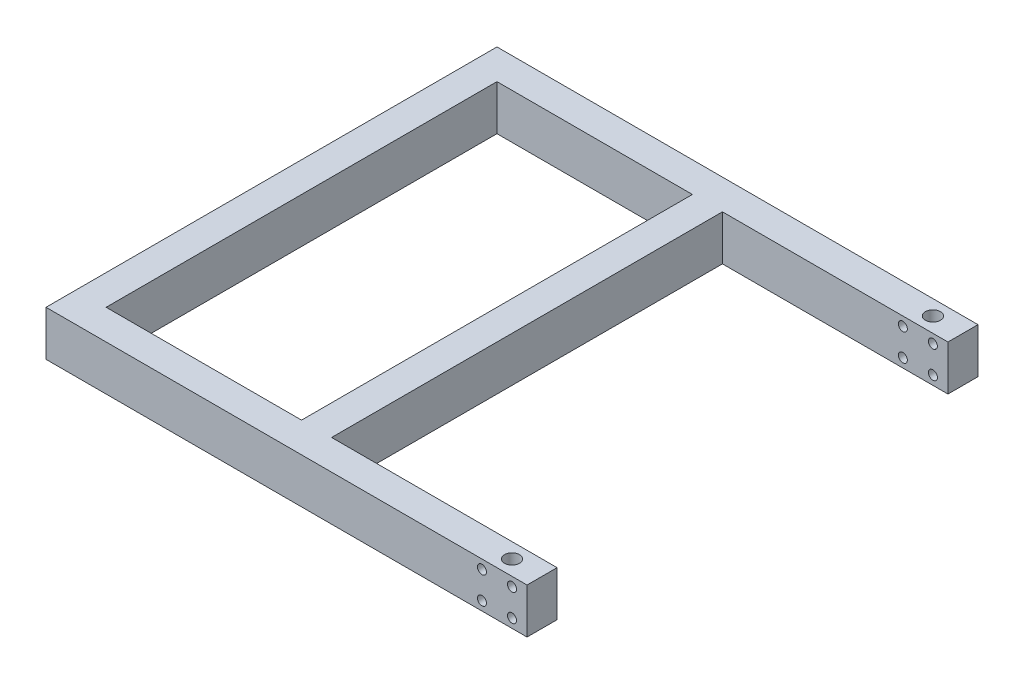
ISO-10303-21;
HEADER;
FILE_DESCRIPTION(('STEP AP214'),'2;1');
FILE_NAME('part.step','',(''),(''),'','','');
FILE_SCHEMA(('AUTOMOTIVE_DESIGN { 1 0 10303 214 1 1 1 1 }'));
ENDSEC;
DATA;
#1=APPLICATION_CONTEXT('core data for automotive mechanical design processes');
#2=APPLICATION_PROTOCOL_DEFINITION('international standard','automotive_design',2000,#1);
#3=PRODUCT_CONTEXT('',#1,'mechanical');
#4=PRODUCT('Part','Part','',(#3));
#5=PRODUCT_RELATED_PRODUCT_CATEGORY('part','',(#4));
#6=PRODUCT_DEFINITION_FORMATION('','',#4);
#7=PRODUCT_DEFINITION_CONTEXT('part definition',#1,'design');
#8=PRODUCT_DEFINITION('design','',#6,#7);
#9=PRODUCT_DEFINITION_SHAPE('','',#8);
#10=(LENGTH_UNIT() NAMED_UNIT(*) SI_UNIT(.MILLI.,.METRE.));
#11=(NAMED_UNIT(*) PLANE_ANGLE_UNIT() SI_UNIT($,.RADIAN.));
#12=(NAMED_UNIT(*) SI_UNIT($,.STERADIAN.) SOLID_ANGLE_UNIT());
#13=UNCERTAINTY_MEASURE_WITH_UNIT(LENGTH_MEASURE(1.E-05),#10,'distance_accuracy_value','');
#14=(GEOMETRIC_REPRESENTATION_CONTEXT(3) GLOBAL_UNCERTAINTY_ASSIGNED_CONTEXT((#13)) GLOBAL_UNIT_ASSIGNED_CONTEXT((#10,
#11,#12)) REPRESENTATION_CONTEXT('',''));
#15=CARTESIAN_POINT('',(0.,0.,0.));
#16=DIRECTION('',(0.,0.,1.));
#17=DIRECTION('',(1.,0.,0.));
#18=AXIS2_PLACEMENT_3D('',#15,#16,#17);
#19=CARTESIAN_POINT('',(-85.,15.,0.));
#20=DIRECTION('',(1.,0.,0.));
#21=DIRECTION('',(0.,0.,-1.));
#22=AXIS2_PLACEMENT_3D('',#19,#20,#21);
#23=PLANE('',#22);
#24=DIRECTION('',(0.,0.,1.));
#25=VECTOR('',#24,1.);
#26=CARTESIAN_POINT('',(-85.,0.,0.));
#27=LINE('',#26,#25);
#28=CARTESIAN_POINT('',(-85.,0.,-63.0645161290323));
#29=VERTEX_POINT('',#28);
#30=CARTESIAN_POINT('',(-85.,0.,66.9354838709677));
#31=VERTEX_POINT('',#30);
#32=EDGE_CURVE('E194',#29,#31,#27,.T.);
#33=ORIENTED_EDGE('',*,*,#32,.T.);
#34=DIRECTION('',(0.,-1.,0.));
#35=VECTOR('',#34,1.);
#36=CARTESIAN_POINT('',(-85.,15.,66.9354838709677));
#37=LINE('',#36,#35);
#38=CARTESIAN_POINT('',(-85.,15.,66.9354838709677));
#39=VERTEX_POINT('',#38);
#40=EDGE_CURVE('E11',#39,#31,#37,.T.);
#41=ORIENTED_EDGE('',*,*,#40,.F.);
#42=DIRECTION('',(0.,0.,1.));
#43=VECTOR('',#42,1.);
#44=CARTESIAN_POINT('',(-85.,15.,0.));
#45=LINE('',#44,#43);
#46=CARTESIAN_POINT('',(-85.,15.,-63.0645161290323));
#47=VERTEX_POINT('',#46);
#48=EDGE_CURVE('E145',#47,#39,#45,.T.);
#49=ORIENTED_EDGE('',*,*,#48,.F.);
#50=DIRECTION('',(0.,-1.,0.));
#51=VECTOR('',#50,1.);
#52=CARTESIAN_POINT('',(-85.,15.,-63.0645161290323));
#53=LINE('',#52,#51);
#54=EDGE_CURVE('E60',#47,#29,#53,.T.);
#55=ORIENTED_EDGE('',*,*,#54,.T.);
#56=EDGE_LOOP('',(#33,#41,#49,#55));
#57=FACE_BOUND('',#56,.T.);
#58=ADVANCED_FACE('F40',(#57),#23,.F.);
#59=CARTESIAN_POINT('',(0.,15.,66.9354838709677));
#60=DIRECTION('',(0.,0.,1.));
#61=DIRECTION('',(1.,0.,0.));
#62=AXIS2_PLACEMENT_3D('',#59,#60,#61);
#63=PLANE('',#62);
#64=DIRECTION('',(-1.,0.,0.));
#65=VECTOR('',#64,1.);
#66=CARTESIAN_POINT('',(0.,0.,66.9354838709677));
#67=LINE('',#66,#65);
#68=CARTESIAN_POINT('',(-150.,0.,66.9354838709678));
#69=VERTEX_POINT('',#68);
#70=EDGE_CURVE('E152',#31,#69,#67,.T.);
#71=ORIENTED_EDGE('',*,*,#70,.T.);
#72=DIRECTION('',(0.,-1.,0.));
#73=VECTOR('',#72,1.);
#74=CARTESIAN_POINT('',(-150.,15.,66.9354838709678));
#75=LINE('',#74,#73);
#76=CARTESIAN_POINT('',(-150.,15.,66.9354838709678));
#77=VERTEX_POINT('',#76);
#78=EDGE_CURVE('E51',#77,#69,#75,.T.);
#79=ORIENTED_EDGE('',*,*,#78,.F.);
#80=DIRECTION('',(-1.,0.,0.));
#81=VECTOR('',#80,1.);
#82=CARTESIAN_POINT('',(0.,15.,66.9354838709677));
#83=LINE('',#82,#81);
#84=EDGE_CURVE('E139',#39,#77,#83,.T.);
#85=ORIENTED_EDGE('',*,*,#84,.F.);
#86=ORIENTED_EDGE('',*,*,#40,.T.);
#87=EDGE_LOOP('',(#71,#79,#85,#86));
#88=FACE_BOUND('',#87,.T.);
#89=ADVANCED_FACE('F151',(#88),#63,.F.);
#90=CARTESIAN_POINT('',(-150.,15.,0.));
#91=DIRECTION('',(1.,0.,0.));
#92=DIRECTION('',(0.,0.,-1.));
#93=AXIS2_PLACEMENT_3D('',#90,#91,#92);
#94=PLANE('',#93);
#95=DIRECTION('',(0.,0.,1.));
#96=VECTOR('',#95,1.);
#97=CARTESIAN_POINT('',(-150.,0.,0.));
#98=LINE('',#97,#96);
#99=CARTESIAN_POINT('',(-150.,0.,-63.0645161290323));
#100=VERTEX_POINT('',#99);
#101=EDGE_CURVE('E199',#100,#69,#98,.T.);
#102=ORIENTED_EDGE('',*,*,#101,.F.);
#103=DIRECTION('',(0.,-1.,0.));
#104=VECTOR('',#103,1.);
#105=CARTESIAN_POINT('',(-150.,15.,-63.0645161290323));
#106=LINE('',#105,#104);
#107=CARTESIAN_POINT('',(-150.,15.,-63.0645161290323));
#108=VERTEX_POINT('',#107);
#109=EDGE_CURVE('E98',#108,#100,#106,.T.);
#110=ORIENTED_EDGE('',*,*,#109,.F.);
#111=DIRECTION('',(0.,0.,1.));
#112=VECTOR('',#111,1.);
#113=CARTESIAN_POINT('',(-150.,15.,0.));
#114=LINE('',#113,#112);
#115=EDGE_CURVE('E144',#108,#77,#114,.T.);
#116=ORIENTED_EDGE('',*,*,#115,.T.);
#117=ORIENTED_EDGE('',*,*,#78,.T.);
#118=EDGE_LOOP('',(#102,#110,#116,#117));
#119=FACE_BOUND('',#118,.T.);
#120=ADVANCED_FACE('F157',(#119),#94,.T.);
#121=CARTESIAN_POINT('',(-160.,15.,0.));
#122=DIRECTION('',(1.,0.,0.));
#123=DIRECTION('',(0.,0.,-1.));
#124=AXIS2_PLACEMENT_3D('',#121,#122,#123);
#125=PLANE('',#124);
#126=CARTESIAN_POINT('',(-160.,7.5,-63.0645161290323));
#127=DIRECTION('',(-1.,0.,0.));
#128=DIRECTION('',(0.,0.,1.));
#129=AXIS2_PLACEMENT_3D('',#126,#127,#128);
#130=CIRCLE('',#129,2.5);
#131=CARTESIAN_POINT('',(-160.,7.5,-60.5645161290323));
#132=VERTEX_POINT('',#131);
#133=EDGE_CURVE('E379',#132,#132,#130,.T.);
#134=ORIENTED_EDGE('',*,*,#133,.F.);
#135=EDGE_LOOP('',(#134));
#136=FACE_BOUND('',#135,.T.);
#137=CARTESIAN_POINT('',(-160.,7.5,-13.0645161290323));
#138=DIRECTION('',(-1.,0.,0.));
#139=DIRECTION('',(0.,0.,1.));
#140=AXIS2_PLACEMENT_3D('',#137,#138,#139);
#141=CIRCLE('',#140,2.5);
#142=CARTESIAN_POINT('',(-160.,7.5,-10.5645161290323));
#143=VERTEX_POINT('',#142);
#144=EDGE_CURVE('E371',#143,#143,#141,.T.);
#145=ORIENTED_EDGE('',*,*,#144,.F.);
#146=EDGE_LOOP('',(#145));
#147=FACE_BOUND('',#146,.T.);
#148=CARTESIAN_POINT('',(-160.,7.5,16.9354838709677));
#149=DIRECTION('',(-1.,0.,0.));
#150=DIRECTION('',(0.,0.,1.));
#151=AXIS2_PLACEMENT_3D('',#148,#149,#150);
#152=CIRCLE('',#151,2.5);
#153=CARTESIAN_POINT('',(-160.,7.5,19.4354838709677));
#154=VERTEX_POINT('',#153);
#155=EDGE_CURVE('E363',#154,#154,#152,.T.);
#156=ORIENTED_EDGE('',*,*,#155,.F.);
#157=EDGE_LOOP('',(#156));
#158=FACE_BOUND('',#157,.T.);
#159=CARTESIAN_POINT('',(-160.,7.5,66.9354838709677));
#160=DIRECTION('',(-1.,0.,0.));
#161=DIRECTION('',(0.,0.,1.));
#162=AXIS2_PLACEMENT_3D('',#159,#160,#161);
#163=CIRCLE('',#162,2.5);
#164=CARTESIAN_POINT('',(-160.,7.5,69.4354838709677));
#165=VERTEX_POINT('',#164);
#166=EDGE_CURVE('E354',#165,#165,#163,.T.);
#167=ORIENTED_EDGE('',*,*,#166,.F.);
#168=EDGE_LOOP('',(#167));
#169=FACE_BOUND('',#168,.T.);
#170=DIRECTION('',(0.,0.,1.));
#171=VECTOR('',#170,1.);
#172=CARTESIAN_POINT('',(-160.,0.,0.));
#173=LINE('',#172,#171);
#174=CARTESIAN_POINT('',(-160.,0.,-73.0645161290323));
#175=VERTEX_POINT('',#174);
#176=CARTESIAN_POINT('',(-160.,0.,76.9354838709677));
#177=VERTEX_POINT('',#176);
#178=EDGE_CURVE('E166',#175,#177,#173,.T.);
#179=ORIENTED_EDGE('',*,*,#178,.T.);
#180=DIRECTION('',(0.,-1.,0.));
#181=VECTOR('',#180,1.);
#182=CARTESIAN_POINT('',(-160.,15.,76.9354838709677));
#183=LINE('',#182,#181);
#184=CARTESIAN_POINT('',(-160.,15.,76.9354838709677));
#185=VERTEX_POINT('',#184);
#186=EDGE_CURVE('E44',#185,#177,#183,.T.);
#187=ORIENTED_EDGE('',*,*,#186,.F.);
#188=DIRECTION('',(0.,0.,1.));
#189=VECTOR('',#188,1.);
#190=CARTESIAN_POINT('',(-160.,15.,0.));
#191=LINE('',#190,#189);
#192=CARTESIAN_POINT('',(-160.,15.,-73.0645161290323));
#193=VERTEX_POINT('',#192);
#194=EDGE_CURVE('E206',#193,#185,#191,.T.);
#195=ORIENTED_EDGE('',*,*,#194,.F.);
#196=DIRECTION('',(0.,-1.,0.));
#197=VECTOR('',#196,1.);
#198=CARTESIAN_POINT('',(-160.,15.,-73.0645161290323));
#199=LINE('',#198,#197);
#200=EDGE_CURVE('E162',#193,#175,#199,.T.);
#201=ORIENTED_EDGE('',*,*,#200,.T.);
#202=EDGE_LOOP('',(#179,#187,#195,#201));
#203=FACE_BOUND('',#202,.T.);
#204=ADVANCED_FACE('F42',(#136,#147,#158,#169,#203),#125,.F.);
#205=CARTESIAN_POINT('',(0.,15.,76.9354838709677));
#206=DIRECTION('',(0.,0.,-1.));
#207=DIRECTION('',(-1.,0.,0.));
#208=AXIS2_PLACEMENT_3D('',#205,#206,#207);
#209=PLANE('',#208);
#210=CARTESIAN_POINT('',(-5.,3.,76.9354838709677));
#211=DIRECTION('',(0.,0.,1.));
#212=DIRECTION('',(1.,0.,0.));
#213=AXIS2_PLACEMENT_3D('',#210,#211,#212);
#214=CIRCLE('',#213,1.5);
#215=CARTESIAN_POINT('',(-3.5,3.,76.9354838709677));
#216=VERTEX_POINT('',#215);
#217=EDGE_CURVE('E339',#216,#216,#214,.T.);
#218=ORIENTED_EDGE('',*,*,#217,.F.);
#219=EDGE_LOOP('',(#218));
#220=FACE_BOUND('',#219,.T.);
#221=CARTESIAN_POINT('',(-15.,12.,76.9354838709677));
#222=DIRECTION('',(0.,0.,1.));
#223=DIRECTION('',(1.,0.,0.));
#224=AXIS2_PLACEMENT_3D('',#221,#222,#223);
#225=CIRCLE('',#224,1.5);
#226=CARTESIAN_POINT('',(-13.5,12.,76.9354838709677));
#227=VERTEX_POINT('',#226);
#228=EDGE_CURVE('E330',#227,#227,#225,.T.);
#229=ORIENTED_EDGE('',*,*,#228,.F.);
#230=EDGE_LOOP('',(#229));
#231=FACE_BOUND('',#230,.T.);
#232=CARTESIAN_POINT('',(-15.,3.,76.9354838709677));
#233=DIRECTION('',(0.,0.,1.));
#234=DIRECTION('',(1.,0.,0.));
#235=AXIS2_PLACEMENT_3D('',#232,#233,#234);
#236=CIRCLE('',#235,1.5);
#237=CARTESIAN_POINT('',(-13.5,3.,76.9354838709677));
#238=VERTEX_POINT('',#237);
#239=EDGE_CURVE('E346',#238,#238,#236,.T.);
#240=ORIENTED_EDGE('',*,*,#239,.F.);
#241=EDGE_LOOP('',(#240));
#242=FACE_BOUND('',#241,.T.);
#243=CARTESIAN_POINT('',(-5.,12.,76.9354838709677));
#244=DIRECTION('',(0.,0.,1.));
#245=DIRECTION('',(1.,0.,0.));
#246=AXIS2_PLACEMENT_3D('',#243,#244,#245);
#247=CIRCLE('',#246,1.5);
#248=CARTESIAN_POINT('',(-3.5,12.,76.9354838709677));
#249=VERTEX_POINT('',#248);
#250=EDGE_CURVE('E322',#249,#249,#247,.T.);
#251=ORIENTED_EDGE('',*,*,#250,.F.);
#252=EDGE_LOOP('',(#251));
#253=FACE_BOUND('',#252,.T.);
#254=DIRECTION('',(1.,0.,0.));
#255=VECTOR('',#254,1.);
#256=CARTESIAN_POINT('',(0.,0.,76.9354838709677));
#257=LINE('',#256,#255);
#258=CARTESIAN_POINT('',(0.,0.,76.9354838709677));
#259=VERTEX_POINT('',#258);
#260=EDGE_CURVE('E170',#177,#259,#257,.T.);
#261=ORIENTED_EDGE('',*,*,#260,.T.);
#262=DIRECTION('',(0.,-1.,0.));
#263=VECTOR('',#262,1.);
#264=CARTESIAN_POINT('',(0.,15.,76.9354838709677));
#265=LINE('',#264,#263);
#266=CARTESIAN_POINT('',(0.,15.,76.9354838709677));
#267=VERTEX_POINT('',#266);
#268=EDGE_CURVE('E231',#267,#259,#265,.T.);
#269=ORIENTED_EDGE('',*,*,#268,.F.);
#270=DIRECTION('',(1.,0.,0.));
#271=VECTOR('',#270,1.);
#272=CARTESIAN_POINT('',(0.,15.,76.9354838709677));
#273=LINE('',#272,#271);
#274=EDGE_CURVE('E111',#185,#267,#273,.T.);
#275=ORIENTED_EDGE('',*,*,#274,.F.);
#276=ORIENTED_EDGE('',*,*,#186,.T.);
#277=EDGE_LOOP('',(#261,#269,#275,#276));
#278=FACE_BOUND('',#277,.T.);
#279=ADVANCED_FACE('F239',(#220,#231,#242,#253,#278),#209,.F.);
#280=CARTESIAN_POINT('',(0.,15.,0.));
#281=DIRECTION('',(-1.,0.,0.));
#282=DIRECTION('',(0.,0.,1.));
#283=AXIS2_PLACEMENT_3D('',#280,#281,#282);
#284=PLANE('',#283);
#285=DIRECTION('',(0.,0.,-1.));
#286=VECTOR('',#285,1.);
#287=CARTESIAN_POINT('',(0.,0.,0.));
#288=LINE('',#287,#286);
#289=CARTESIAN_POINT('',(0.,0.,66.9354838709677));
#290=VERTEX_POINT('',#289);
#291=EDGE_CURVE('E174',#259,#290,#288,.T.);
#292=ORIENTED_EDGE('',*,*,#291,.T.);
#293=DIRECTION('',(0.,-1.,0.));
#294=VECTOR('',#293,1.);
#295=CARTESIAN_POINT('',(0.,15.,66.9354838709677));
#296=LINE('',#295,#294);
#297=CARTESIAN_POINT('',(0.,15.,66.9354838709677));
#298=VERTEX_POINT('',#297);
#299=EDGE_CURVE('E228',#298,#290,#296,.T.);
#300=ORIENTED_EDGE('',*,*,#299,.F.);
#301=DIRECTION('',(0.,0.,-1.));
#302=VECTOR('',#301,1.);
#303=CARTESIAN_POINT('',(0.,15.,0.));
#304=LINE('',#303,#302);
#305=EDGE_CURVE('E262',#267,#298,#304,.T.);
#306=ORIENTED_EDGE('',*,*,#305,.F.);
#307=ORIENTED_EDGE('',*,*,#268,.T.);
#308=EDGE_LOOP('',(#292,#300,#306,#307));
#309=FACE_BOUND('',#308,.T.);
#310=ADVANCED_FACE('F252',(#309),#284,.F.);
#311=CARTESIAN_POINT('',(0.,15.,66.9354838709677));
#312=DIRECTION('',(0.,0.,1.));
#313=DIRECTION('',(1.,0.,0.));
#314=AXIS2_PLACEMENT_3D('',#311,#312,#313);
#315=PLANE('',#314);
#316=CARTESIAN_POINT('',(-5.,3.,66.9354838709677));
#317=DIRECTION('',(0.,0.,1.));
#318=DIRECTION('',(1.,0.,0.));
#319=AXIS2_PLACEMENT_3D('',#316,#317,#318);
#320=CIRCLE('',#319,1.5);
#321=CARTESIAN_POINT('',(-3.5,3.,66.9354838709677));
#322=VERTEX_POINT('',#321);
#323=EDGE_CURVE('E171',#322,#322,#320,.T.);
#324=ORIENTED_EDGE('',*,*,#323,.T.);
#325=EDGE_LOOP('',(#324));
#326=FACE_BOUND('',#325,.T.);
#327=CARTESIAN_POINT('',(-15.,12.,66.9354838709677));
#328=DIRECTION('',(0.,0.,1.));
#329=DIRECTION('',(1.,0.,0.));
#330=AXIS2_PLACEMENT_3D('',#327,#328,#329);
#331=CIRCLE('',#330,1.5);
#332=CARTESIAN_POINT('',(-13.5,12.,66.9354838709677));
#333=VERTEX_POINT('',#332);
#334=EDGE_CURVE('E297',#333,#333,#331,.T.);
#335=ORIENTED_EDGE('',*,*,#334,.T.);
#336=EDGE_LOOP('',(#335));
#337=FACE_BOUND('',#336,.T.);
#338=CARTESIAN_POINT('',(-15.,3.,66.9354838709677));
#339=DIRECTION('',(0.,0.,1.));
#340=DIRECTION('',(1.,0.,0.));
#341=AXIS2_PLACEMENT_3D('',#338,#339,#340);
#342=CIRCLE('',#341,1.5);
#343=CARTESIAN_POINT('',(-13.5,3.,66.9354838709677));
#344=VERTEX_POINT('',#343);
#345=EDGE_CURVE('E305',#344,#344,#342,.T.);
#346=ORIENTED_EDGE('',*,*,#345,.T.);
#347=EDGE_LOOP('',(#346));
#348=FACE_BOUND('',#347,.T.);
#349=CARTESIAN_POINT('',(-5.,12.,66.9354838709677));
#350=DIRECTION('',(0.,0.,1.));
#351=DIRECTION('',(1.,0.,0.));
#352=AXIS2_PLACEMENT_3D('',#349,#350,#351);
#353=CIRCLE('',#352,1.5);
#354=CARTESIAN_POINT('',(-3.5,12.,66.9354838709677));
#355=VERTEX_POINT('',#354);
#356=EDGE_CURVE('E313',#355,#355,#353,.T.);
#357=ORIENTED_EDGE('',*,*,#356,.T.);
#358=EDGE_LOOP('',(#357));
#359=FACE_BOUND('',#358,.T.);
#360=DIRECTION('',(-1.,0.,0.));
#361=VECTOR('',#360,1.);
#362=CARTESIAN_POINT('',(0.,0.,66.9354838709677));
#363=LINE('',#362,#361);
#364=CARTESIAN_POINT('',(-75.,0.,66.9354838709677));
#365=VERTEX_POINT('',#364);
#366=EDGE_CURVE('E177',#290,#365,#363,.T.);
#367=ORIENTED_EDGE('',*,*,#366,.T.);
#368=DIRECTION('',(0.,-1.,0.));
#369=VECTOR('',#368,1.);
#370=CARTESIAN_POINT('',(-75.,15.,66.9354838709677));
#371=LINE('',#370,#369);
#372=CARTESIAN_POINT('',(-75.,15.,66.9354838709677));
#373=VERTEX_POINT('',#372);
#374=EDGE_CURVE('E224',#373,#365,#371,.T.);
#375=ORIENTED_EDGE('',*,*,#374,.F.);
#376=DIRECTION('',(-1.,0.,0.));
#377=VECTOR('',#376,1.);
#378=CARTESIAN_POINT('',(0.,15.,66.9354838709677));
#379=LINE('',#378,#377);
#380=EDGE_CURVE('E257',#298,#373,#379,.T.);
#381=ORIENTED_EDGE('',*,*,#380,.F.);
#382=ORIENTED_EDGE('',*,*,#299,.T.);
#383=EDGE_LOOP('',(#367,#375,#381,#382));
#384=FACE_BOUND('',#383,.T.);
#385=ADVANCED_FACE('F255',(#326,#337,#348,#359,#384),#315,.F.);
#386=CARTESIAN_POINT('',(-75.,15.,0.));
#387=DIRECTION('',(-1.,0.,0.));
#388=DIRECTION('',(0.,0.,1.));
#389=AXIS2_PLACEMENT_3D('',#386,#387,#388);
#390=PLANE('',#389);
#391=DIRECTION('',(0.,0.,-1.));
#392=VECTOR('',#391,1.);
#393=CARTESIAN_POINT('',(-75.,0.,0.));
#394=LINE('',#393,#392);
#395=CARTESIAN_POINT('',(-75.,0.,-63.0645161290323));
#396=VERTEX_POINT('',#395);
#397=EDGE_CURVE('E180',#365,#396,#394,.T.);
#398=ORIENTED_EDGE('',*,*,#397,.T.);
#399=DIRECTION('',(0.,-1.,0.));
#400=VECTOR('',#399,1.);
#401=CARTESIAN_POINT('',(-75.,15.,-63.0645161290323));
#402=LINE('',#401,#400);
#403=CARTESIAN_POINT('',(-75.,15.,-63.0645161290323));
#404=VERTEX_POINT('',#403);
#405=EDGE_CURVE('E221',#404,#396,#402,.T.);
#406=ORIENTED_EDGE('',*,*,#405,.F.);
#407=DIRECTION('',(0.,0.,-1.));
#408=VECTOR('',#407,1.);
#409=CARTESIAN_POINT('',(-75.,15.,0.));
#410=LINE('',#409,#408);
#411=EDGE_CURVE('E261',#373,#404,#410,.T.);
#412=ORIENTED_EDGE('',*,*,#411,.F.);
#413=ORIENTED_EDGE('',*,*,#374,.T.);
#414=EDGE_LOOP('',(#398,#406,#412,#413));
#415=FACE_BOUND('',#414,.T.);
#416=ADVANCED_FACE('F446',(#415),#390,.F.);
#417=CARTESIAN_POINT('',(0.,15.,-63.0645161290323));
#418=DIRECTION('',(0.,0.,1.));
#419=DIRECTION('',(1.,0.,0.));
#420=AXIS2_PLACEMENT_3D('',#417,#418,#419);
#421=PLANE('',#420);
#422=CARTESIAN_POINT('',(-5.,3.,-63.0645161290323));
#423=DIRECTION('',(0.,0.,1.));
#424=DIRECTION('',(1.,0.,0.));
#425=AXIS2_PLACEMENT_3D('',#422,#423,#424);
#426=CIRCLE('',#425,1.5);
#427=CARTESIAN_POINT('',(-3.5,3.,-63.0645161290323));
#428=VERTEX_POINT('',#427);
#429=EDGE_CURVE('E293',#428,#428,#426,.T.);
#430=ORIENTED_EDGE('',*,*,#429,.F.);
#431=EDGE_LOOP('',(#430));
#432=FACE_BOUND('',#431,.T.);
#433=CARTESIAN_POINT('',(-15.,12.,-63.0645161290323));
#434=DIRECTION('',(0.,0.,1.));
#435=DIRECTION('',(1.,0.,0.));
#436=AXIS2_PLACEMENT_3D('',#433,#434,#435);
#437=CIRCLE('',#436,1.5);
#438=CARTESIAN_POINT('',(-13.5,12.,-63.0645161290323));
#439=VERTEX_POINT('',#438);
#440=EDGE_CURVE('E301',#439,#439,#437,.T.);
#441=ORIENTED_EDGE('',*,*,#440,.F.);
#442=EDGE_LOOP('',(#441));
#443=FACE_BOUND('',#442,.T.);
#444=CARTESIAN_POINT('',(-15.,3.,-63.0645161290323));
#445=DIRECTION('',(0.,0.,1.));
#446=DIRECTION('',(1.,0.,0.));
#447=AXIS2_PLACEMENT_3D('',#444,#445,#446);
#448=CIRCLE('',#447,1.5);
#449=CARTESIAN_POINT('',(-13.5,3.,-63.0645161290323));
#450=VERTEX_POINT('',#449);
#451=EDGE_CURVE('E309',#450,#450,#448,.T.);
#452=ORIENTED_EDGE('',*,*,#451,.F.);
#453=EDGE_LOOP('',(#452));
#454=FACE_BOUND('',#453,.T.);
#455=CARTESIAN_POINT('',(-5.,12.,-63.0645161290323));
#456=DIRECTION('',(0.,0.,1.));
#457=DIRECTION('',(1.,0.,0.));
#458=AXIS2_PLACEMENT_3D('',#455,#456,#457);
#459=CIRCLE('',#458,1.5);
#460=CARTESIAN_POINT('',(-3.5,12.,-63.0645161290323));
#461=VERTEX_POINT('',#460);
#462=EDGE_CURVE('E317',#461,#461,#459,.T.);
#463=ORIENTED_EDGE('',*,*,#462,.F.);
#464=EDGE_LOOP('',(#463));
#465=FACE_BOUND('',#464,.T.);
#466=DIRECTION('',(-1.,0.,0.));
#467=VECTOR('',#466,1.);
#468=CARTESIAN_POINT('',(0.,0.,-63.0645161290323));
#469=LINE('',#468,#467);
#470=CARTESIAN_POINT('',(0.,0.,-63.0645161290323));
#471=VERTEX_POINT('',#470);
#472=EDGE_CURVE('E184',#471,#396,#469,.T.);
#473=ORIENTED_EDGE('',*,*,#472,.F.);
#474=DIRECTION('',(0.,-1.,0.));
#475=VECTOR('',#474,1.);
#476=CARTESIAN_POINT('',(0.,15.,-63.0645161290323));
#477=LINE('',#476,#475);
#478=CARTESIAN_POINT('',(0.,15.,-63.0645161290323));
#479=VERTEX_POINT('',#478);
#480=EDGE_CURVE('E218',#479,#471,#477,.T.);
#481=ORIENTED_EDGE('',*,*,#480,.F.);
#482=DIRECTION('',(-1.,0.,0.));
#483=VECTOR('',#482,1.);
#484=CARTESIAN_POINT('',(0.,15.,-63.0645161290323));
#485=LINE('',#484,#483);
#486=EDGE_CURVE('E266',#479,#404,#485,.T.);
#487=ORIENTED_EDGE('',*,*,#486,.T.);
#488=ORIENTED_EDGE('',*,*,#405,.T.);
#489=EDGE_LOOP('',(#473,#481,#487,#488));
#490=FACE_BOUND('',#489,.T.);
#491=ADVANCED_FACE('F442',(#432,#443,#454,#465,#490),#421,.T.);
#492=CARTESIAN_POINT('',(0.,15.,0.));
#493=DIRECTION('',(-1.,0.,0.));
#494=DIRECTION('',(0.,0.,1.));
#495=AXIS2_PLACEMENT_3D('',#492,#493,#494);
#496=PLANE('',#495);
#497=DIRECTION('',(0.,0.,-1.));
#498=VECTOR('',#497,1.);
#499=CARTESIAN_POINT('',(0.,0.,0.));
#500=LINE('',#499,#498);
#501=CARTESIAN_POINT('',(0.,0.,-73.0645161290323));
#502=VERTEX_POINT('',#501);
#503=EDGE_CURVE('E188',#471,#502,#500,.T.);
#504=ORIENTED_EDGE('',*,*,#503,.T.);
#505=DIRECTION('',(0.,-1.,0.));
#506=VECTOR('',#505,1.);
#507=CARTESIAN_POINT('',(0.,15.,-73.0645161290323));
#508=LINE('',#507,#506);
#509=CARTESIAN_POINT('',(0.,15.,-73.0645161290323));
#510=VERTEX_POINT('',#509);
#511=EDGE_CURVE('E214',#510,#502,#508,.T.);
#512=ORIENTED_EDGE('',*,*,#511,.F.);
#513=DIRECTION('',(0.,0.,-1.));
#514=VECTOR('',#513,1.);
#515=CARTESIAN_POINT('',(0.,15.,0.));
#516=LINE('',#515,#514);
#517=EDGE_CURVE('E274',#479,#510,#516,.T.);
#518=ORIENTED_EDGE('',*,*,#517,.F.);
#519=ORIENTED_EDGE('',*,*,#480,.T.);
#520=EDGE_LOOP('',(#504,#512,#518,#519));
#521=FACE_BOUND('',#520,.T.);
#522=ADVANCED_FACE('F438',(#521),#496,.F.);
#523=CARTESIAN_POINT('',(0.,15.,-73.0645161290323));
#524=DIRECTION('',(0.,0.,1.));
#525=DIRECTION('',(1.,0.,0.));
#526=AXIS2_PLACEMENT_3D('',#523,#524,#525);
#527=PLANE('',#526);
#528=CARTESIAN_POINT('',(-5.,3.,-73.0645161290323));
#529=DIRECTION('',(0.,0.,1.));
#530=DIRECTION('',(1.,0.,0.));
#531=AXIS2_PLACEMENT_3D('',#528,#529,#530);
#532=CIRCLE('',#531,1.5);
#533=CARTESIAN_POINT('',(-3.5,3.,-73.0645161290323));
#534=VERTEX_POINT('',#533);
#535=EDGE_CURVE('E326',#534,#534,#532,.T.);
#536=ORIENTED_EDGE('',*,*,#535,.T.);
#537=EDGE_LOOP('',(#536));
#538=FACE_BOUND('',#537,.T.);
#539=CARTESIAN_POINT('',(-15.,12.,-73.0645161290323));
#540=DIRECTION('',(0.,0.,1.));
#541=DIRECTION('',(1.,0.,0.));
#542=AXIS2_PLACEMENT_3D('',#539,#540,#541);
#543=CIRCLE('',#542,1.5);
#544=CARTESIAN_POINT('',(-13.5,12.,-73.0645161290323));
#545=VERTEX_POINT('',#544);
#546=EDGE_CURVE('E334',#545,#545,#543,.T.);
#547=ORIENTED_EDGE('',*,*,#546,.T.);
#548=EDGE_LOOP('',(#547));
#549=FACE_BOUND('',#548,.T.);
#550=CARTESIAN_POINT('',(-15.,3.,-73.0645161290323));
#551=DIRECTION('',(0.,0.,1.));
#552=DIRECTION('',(1.,0.,0.));
#553=AXIS2_PLACEMENT_3D('',#550,#551,#552);
#554=CIRCLE('',#553,1.5);
#555=CARTESIAN_POINT('',(-13.5,3.,-73.0645161290323));
#556=VERTEX_POINT('',#555);
#557=EDGE_CURVE('E335',#556,#556,#554,.T.);
#558=ORIENTED_EDGE('',*,*,#557,.T.);
#559=EDGE_LOOP('',(#558));
#560=FACE_BOUND('',#559,.T.);
#561=CARTESIAN_POINT('',(-5.,12.,-73.0645161290323));
#562=DIRECTION('',(0.,0.,1.));
#563=DIRECTION('',(1.,0.,0.));
#564=AXIS2_PLACEMENT_3D('',#561,#562,#563);
#565=CIRCLE('',#564,1.5);
#566=CARTESIAN_POINT('',(-3.5,12.,-73.0645161290323));
#567=VERTEX_POINT('',#566);
#568=EDGE_CURVE('E321',#567,#567,#565,.T.);
#569=ORIENTED_EDGE('',*,*,#568,.T.);
#570=EDGE_LOOP('',(#569));
#571=FACE_BOUND('',#570,.T.);
#572=DIRECTION('',(-1.,0.,0.));
#573=VECTOR('',#572,1.);
#574=CARTESIAN_POINT('',(0.,0.,-73.0645161290323));
#575=LINE('',#574,#573);
#576=EDGE_CURVE('E191',#502,#175,#575,.T.);
#577=ORIENTED_EDGE('',*,*,#576,.T.);
#578=ORIENTED_EDGE('',*,*,#200,.F.);
#579=DIRECTION('',(-1.,0.,0.));
#580=VECTOR('',#579,1.);
#581=CARTESIAN_POINT('',(0.,15.,-73.0645161290323));
#582=LINE('',#581,#580);
#583=EDGE_CURVE('E277',#510,#193,#582,.T.);
#584=ORIENTED_EDGE('',*,*,#583,.F.);
#585=ORIENTED_EDGE('',*,*,#511,.T.);
#586=EDGE_LOOP('',(#577,#578,#584,#585));
#587=FACE_BOUND('',#586,.T.);
#588=ADVANCED_FACE('F285',(#538,#549,#560,#571,#587),#527,.F.);
#589=CARTESIAN_POINT('',(0.,15.,-63.0645161290323));
#590=DIRECTION('',(0.,0.,1.));
#591=DIRECTION('',(1.,0.,0.));
#592=AXIS2_PLACEMENT_3D('',#589,#590,#591);
#593=PLANE('',#592);
#594=DIRECTION('',(-1.,0.,0.));
#595=VECTOR('',#594,1.);
#596=CARTESIAN_POINT('',(0.,0.,-63.0645161290323));
#597=LINE('',#596,#595);
#598=EDGE_CURVE('E202',#29,#100,#597,.T.);
#599=ORIENTED_EDGE('',*,*,#598,.F.);
#600=ORIENTED_EDGE('',*,*,#54,.F.);
#601=DIRECTION('',(-1.,0.,0.));
#602=VECTOR('',#601,1.);
#603=CARTESIAN_POINT('',(0.,15.,-63.0645161290323));
#604=LINE('',#603,#602);
#605=EDGE_CURVE('E159',#47,#108,#604,.T.);
#606=ORIENTED_EDGE('',*,*,#605,.T.);
#607=ORIENTED_EDGE('',*,*,#109,.T.);
#608=EDGE_LOOP('',(#599,#600,#606,#607));
#609=FACE_BOUND('',#608,.T.);
#610=ADVANCED_FACE('F413',(#609),#593,.T.);
#611=CARTESIAN_POINT('',(0.,15.,0.));
#612=DIRECTION('',(0.,1.,0.));
#613=DIRECTION('',(0.,0.,1.));
#614=AXIS2_PLACEMENT_3D('',#611,#612,#613);
#615=PLANE('',#614);
#616=CARTESIAN_POINT('',(-10.,15.,-68.0645161290323));
#617=DIRECTION('',(0.,1.,0.));
#618=DIRECTION('',(0.,0.,1.));
#619=AXIS2_PLACEMENT_3D('',#616,#617,#618);
#620=CIRCLE('',#619,2.5);
#621=CARTESIAN_POINT('',(-10.,15.,-65.5645161290323));
#622=VERTEX_POINT('',#621);
#623=EDGE_CURVE('E394',#622,#622,#620,.T.);
#624=ORIENTED_EDGE('',*,*,#623,.F.);
#625=EDGE_LOOP('',(#624));
#626=FACE_BOUND('',#625,.T.);
#627=CARTESIAN_POINT('',(-10.,15.,71.9354838709677));
#628=DIRECTION('',(0.,1.,0.));
#629=DIRECTION('',(0.,0.,1.));
#630=AXIS2_PLACEMENT_3D('',#627,#628,#629);
#631=CIRCLE('',#630,2.5);
#632=CARTESIAN_POINT('',(-10.,15.,74.4354838709677));
#633=VERTEX_POINT('',#632);
#634=EDGE_CURVE('E386',#633,#633,#631,.T.);
#635=ORIENTED_EDGE('',*,*,#634,.F.);
#636=EDGE_LOOP('',(#635));
#637=FACE_BOUND('',#636,.T.);
#638=ORIENTED_EDGE('',*,*,#194,.T.);
#639=ORIENTED_EDGE('',*,*,#274,.T.);
#640=ORIENTED_EDGE('',*,*,#305,.T.);
#641=ORIENTED_EDGE('',*,*,#380,.T.);
#642=ORIENTED_EDGE('',*,*,#411,.T.);
#643=ORIENTED_EDGE('',*,*,#486,.F.);
#644=ORIENTED_EDGE('',*,*,#517,.T.);
#645=ORIENTED_EDGE('',*,*,#583,.T.);
#646=EDGE_LOOP('',(#638,#639,#640,#641,#642,#643,#644,#645));
#647=FACE_BOUND('',#646,.T.);
#648=ORIENTED_EDGE('',*,*,#48,.T.);
#649=ORIENTED_EDGE('',*,*,#84,.T.);
#650=ORIENTED_EDGE('',*,*,#115,.F.);
#651=ORIENTED_EDGE('',*,*,#605,.F.);
#652=EDGE_LOOP('',(#648,#649,#650,#651));
#653=FACE_BOUND('',#652,.T.);
#654=ADVANCED_FACE('F141',(#626,#637,#647,#653),#615,.T.);
#655=CARTESIAN_POINT('',(0.,0.,0.));
#656=DIRECTION('',(0.,1.,0.));
#657=DIRECTION('',(0.,0.,1.));
#658=AXIS2_PLACEMENT_3D('',#655,#656,#657);
#659=PLANE('',#658);
#660=CARTESIAN_POINT('',(-10.,0.,-68.0645161290323));
#661=DIRECTION('',(0.,1.,0.));
#662=DIRECTION('',(0.,0.,1.));
#663=AXIS2_PLACEMENT_3D('',#660,#661,#662);
#664=CIRCLE('',#663,2.5);
#665=CARTESIAN_POINT('',(-10.,0.,-65.5645161290323));
#666=VERTEX_POINT('',#665);
#667=EDGE_CURVE('E359',#666,#666,#664,.T.);
#668=ORIENTED_EDGE('',*,*,#667,.T.);
#669=EDGE_LOOP('',(#668));
#670=FACE_BOUND('',#669,.T.);
#671=CARTESIAN_POINT('',(-10.,0.,71.9354838709677));
#672=DIRECTION('',(0.,1.,0.));
#673=DIRECTION('',(0.,0.,1.));
#674=AXIS2_PLACEMENT_3D('',#671,#672,#673);
#675=CIRCLE('',#674,2.5);
#676=CARTESIAN_POINT('',(-10.,0.,74.4354838709677));
#677=VERTEX_POINT('',#676);
#678=EDGE_CURVE('E390',#677,#677,#675,.T.);
#679=ORIENTED_EDGE('',*,*,#678,.T.);
#680=EDGE_LOOP('',(#679));
#681=FACE_BOUND('',#680,.T.);
#682=ORIENTED_EDGE('',*,*,#178,.F.);
#683=ORIENTED_EDGE('',*,*,#576,.F.);
#684=ORIENTED_EDGE('',*,*,#503,.F.);
#685=ORIENTED_EDGE('',*,*,#472,.T.);
#686=ORIENTED_EDGE('',*,*,#397,.F.);
#687=ORIENTED_EDGE('',*,*,#366,.F.);
#688=ORIENTED_EDGE('',*,*,#291,.F.);
#689=ORIENTED_EDGE('',*,*,#260,.F.);
#690=EDGE_LOOP('',(#682,#683,#684,#685,#686,#687,#688,#689));
#691=FACE_BOUND('',#690,.T.);
#692=ORIENTED_EDGE('',*,*,#32,.F.);
#693=ORIENTED_EDGE('',*,*,#598,.T.);
#694=ORIENTED_EDGE('',*,*,#101,.T.);
#695=ORIENTED_EDGE('',*,*,#70,.F.);
#696=EDGE_LOOP('',(#692,#693,#694,#695));
#697=FACE_BOUND('',#696,.T.);
#698=ADVANCED_FACE('F246',(#670,#681,#691,#697),#659,.F.);
#699=CARTESIAN_POINT('',(-5.,12.,-73.0645161290323));
#700=DIRECTION('',(0.,0.,1.));
#701=DIRECTION('',(1.,0.,0.));
#702=AXIS2_PLACEMENT_3D('',#699,#700,#701);
#703=CYLINDRICAL_SURFACE('',#702,1.5);
#704=ORIENTED_EDGE('',*,*,#462,.T.);
#705=EDGE_LOOP('',(#704));
#706=FACE_BOUND('',#705,.T.);
#707=ORIENTED_EDGE('',*,*,#568,.F.);
#708=EDGE_LOOP('',(#707));
#709=FACE_BOUND('',#708,.T.);
#710=ADVANCED_FACE('F475',(#706,#709),#703,.F.);
#711=CARTESIAN_POINT('',(-15.,3.,-73.0645161290323));
#712=DIRECTION('',(0.,0.,1.));
#713=DIRECTION('',(1.,0.,0.));
#714=AXIS2_PLACEMENT_3D('',#711,#712,#713);
#715=CYLINDRICAL_SURFACE('',#714,1.5);
#716=ORIENTED_EDGE('',*,*,#451,.T.);
#717=EDGE_LOOP('',(#716));
#718=FACE_BOUND('',#717,.T.);
#719=ORIENTED_EDGE('',*,*,#557,.F.);
#720=EDGE_LOOP('',(#719));
#721=FACE_BOUND('',#720,.T.);
#722=ADVANCED_FACE('F485',(#718,#721),#715,.F.);
#723=CARTESIAN_POINT('',(-15.,12.,-73.0645161290323));
#724=DIRECTION('',(0.,0.,1.));
#725=DIRECTION('',(1.,0.,0.));
#726=AXIS2_PLACEMENT_3D('',#723,#724,#725);
#727=CYLINDRICAL_SURFACE('',#726,1.5);
#728=ORIENTED_EDGE('',*,*,#440,.T.);
#729=EDGE_LOOP('',(#728));
#730=FACE_BOUND('',#729,.T.);
#731=ORIENTED_EDGE('',*,*,#546,.F.);
#732=EDGE_LOOP('',(#731));
#733=FACE_BOUND('',#732,.T.);
#734=ADVANCED_FACE('F486',(#730,#733),#727,.F.);
#735=CARTESIAN_POINT('',(-5.,3.,-73.0645161290323));
#736=DIRECTION('',(0.,0.,1.));
#737=DIRECTION('',(1.,0.,0.));
#738=AXIS2_PLACEMENT_3D('',#735,#736,#737);
#739=CYLINDRICAL_SURFACE('',#738,1.5);
#740=ORIENTED_EDGE('',*,*,#429,.T.);
#741=EDGE_LOOP('',(#740));
#742=FACE_BOUND('',#741,.T.);
#743=ORIENTED_EDGE('',*,*,#535,.F.);
#744=EDGE_LOOP('',(#743));
#745=FACE_BOUND('',#744,.T.);
#746=ADVANCED_FACE('F473',(#742,#745),#739,.F.);
#747=ORIENTED_EDGE('',*,*,#250,.T.);
#748=EDGE_LOOP('',(#747));
#749=FACE_BOUND('',#748,.T.);
#750=ORIENTED_EDGE('',*,*,#356,.F.);
#751=EDGE_LOOP('',(#750));
#752=FACE_BOUND('',#751,.T.);
#753=ADVANCED_FACE('F469',(#749,#752),#703,.F.);
#754=ORIENTED_EDGE('',*,*,#239,.T.);
#755=EDGE_LOOP('',(#754));
#756=FACE_BOUND('',#755,.T.);
#757=ORIENTED_EDGE('',*,*,#345,.F.);
#758=EDGE_LOOP('',(#757));
#759=FACE_BOUND('',#758,.T.);
#760=ADVANCED_FACE('F472',(#756,#759),#715,.F.);
#761=ORIENTED_EDGE('',*,*,#228,.T.);
#762=EDGE_LOOP('',(#761));
#763=FACE_BOUND('',#762,.T.);
#764=ORIENTED_EDGE('',*,*,#334,.F.);
#765=EDGE_LOOP('',(#764));
#766=FACE_BOUND('',#765,.T.);
#767=ADVANCED_FACE('F482',(#763,#766),#727,.F.);
#768=ORIENTED_EDGE('',*,*,#217,.T.);
#769=EDGE_LOOP('',(#768));
#770=FACE_BOUND('',#769,.T.);
#771=ORIENTED_EDGE('',*,*,#323,.F.);
#772=EDGE_LOOP('',(#771));
#773=FACE_BOUND('',#772,.T.);
#774=ADVANCED_FACE('F489',(#770,#773),#739,.F.);
#775=CARTESIAN_POINT('',(-153.,7.5,66.9354838709677));
#776=DIRECTION('',(-1.,0.,0.));
#777=DIRECTION('',(0.,0.,1.));
#778=AXIS2_PLACEMENT_3D('',#775,#776,#777);
#779=CYLINDRICAL_SURFACE('',#778,2.5);
#780=CARTESIAN_POINT('',(-153.,7.5,66.9354838709677));
#781=DIRECTION('',(-1.,0.,0.));
#782=DIRECTION('',(0.,0.,1.));
#783=AXIS2_PLACEMENT_3D('',#780,#781,#782);
#784=CIRCLE('',#783,2.5);
#785=CARTESIAN_POINT('',(-153.,7.5,69.4354838709677));
#786=VERTEX_POINT('',#785);
#787=EDGE_CURVE('E358',#786,#786,#784,.T.);
#788=ORIENTED_EDGE('',*,*,#787,.F.);
#789=EDGE_LOOP('',(#788));
#790=FACE_BOUND('',#789,.T.);
#791=ORIENTED_EDGE('',*,*,#166,.T.);
#792=EDGE_LOOP('',(#791));
#793=FACE_BOUND('',#792,.T.);
#794=ADVANCED_FACE('F533',(#790,#793),#779,.F.);
#795=CARTESIAN_POINT('',(-153.,0.,0.));
#796=DIRECTION('',(-1.,0.,0.));
#797=DIRECTION('',(0.,0.,1.));
#798=AXIS2_PLACEMENT_3D('',#795,#796,#797);
#799=PLANE('',#798);
#800=ORIENTED_EDGE('',*,*,#787,.T.);
#801=EDGE_LOOP('',(#800));
#802=FACE_BOUND('',#801,.T.);
#803=ADVANCED_FACE('F538',(#802),#799,.T.);
#804=CARTESIAN_POINT('',(-153.,7.5,16.9354838709677));
#805=DIRECTION('',(-1.,0.,0.));
#806=DIRECTION('',(0.,0.,1.));
#807=AXIS2_PLACEMENT_3D('',#804,#805,#806);
#808=CYLINDRICAL_SURFACE('',#807,2.5);
#809=CARTESIAN_POINT('',(-153.,7.5,16.9354838709677));
#810=DIRECTION('',(-1.,0.,0.));
#811=DIRECTION('',(0.,0.,1.));
#812=AXIS2_PLACEMENT_3D('',#809,#810,#811);
#813=CIRCLE('',#812,2.5);
#814=CARTESIAN_POINT('',(-153.,7.5,19.4354838709677));
#815=VERTEX_POINT('',#814);
#816=EDGE_CURVE('E367',#815,#815,#813,.T.);
#817=ORIENTED_EDGE('',*,*,#816,.F.);
#818=EDGE_LOOP('',(#817));
#819=FACE_BOUND('',#818,.T.);
#820=ORIENTED_EDGE('',*,*,#155,.T.);
#821=EDGE_LOOP('',(#820));
#822=FACE_BOUND('',#821,.T.);
#823=ADVANCED_FACE('F548',(#819,#822),#808,.F.);
#824=CARTESIAN_POINT('',(-153.,0.,0.));
#825=DIRECTION('',(-1.,0.,0.));
#826=DIRECTION('',(0.,0.,1.));
#827=AXIS2_PLACEMENT_3D('',#824,#825,#826);
#828=PLANE('',#827);
#829=ORIENTED_EDGE('',*,*,#816,.T.);
#830=EDGE_LOOP('',(#829));
#831=FACE_BOUND('',#830,.T.);
#832=ADVANCED_FACE('F558',(#831),#828,.T.);
#833=CARTESIAN_POINT('',(-153.,7.5,-13.0645161290323));
#834=DIRECTION('',(-1.,0.,0.));
#835=DIRECTION('',(0.,0.,1.));
#836=AXIS2_PLACEMENT_3D('',#833,#834,#835);
#837=CYLINDRICAL_SURFACE('',#836,2.5);
#838=CARTESIAN_POINT('',(-153.,7.5,-13.0645161290323));
#839=DIRECTION('',(-1.,0.,0.));
#840=DIRECTION('',(0.,0.,1.));
#841=AXIS2_PLACEMENT_3D('',#838,#839,#840);
#842=CIRCLE('',#841,2.5);
#843=CARTESIAN_POINT('',(-153.,7.5,-10.5645161290323));
#844=VERTEX_POINT('',#843);
#845=EDGE_CURVE('E375',#844,#844,#842,.T.);
#846=ORIENTED_EDGE('',*,*,#845,.F.);
#847=EDGE_LOOP('',(#846));
#848=FACE_BOUND('',#847,.T.);
#849=ORIENTED_EDGE('',*,*,#144,.T.);
#850=EDGE_LOOP('',(#849));
#851=FACE_BOUND('',#850,.T.);
#852=ADVANCED_FACE('F568',(#848,#851),#837,.F.);
#853=CARTESIAN_POINT('',(-153.,0.,0.));
#854=DIRECTION('',(-1.,0.,0.));
#855=DIRECTION('',(0.,0.,1.));
#856=AXIS2_PLACEMENT_3D('',#853,#854,#855);
#857=PLANE('',#856);
#858=ORIENTED_EDGE('',*,*,#845,.T.);
#859=EDGE_LOOP('',(#858));
#860=FACE_BOUND('',#859,.T.);
#861=ADVANCED_FACE('F578',(#860),#857,.T.);
#862=CARTESIAN_POINT('',(-153.,7.5,-63.0645161290323));
#863=DIRECTION('',(-1.,0.,0.));
#864=DIRECTION('',(0.,0.,1.));
#865=AXIS2_PLACEMENT_3D('',#862,#863,#864);
#866=CYLINDRICAL_SURFACE('',#865,2.5);
#867=CARTESIAN_POINT('',(-153.,7.5,-63.0645161290323));
#868=DIRECTION('',(-1.,0.,0.));
#869=DIRECTION('',(0.,0.,1.));
#870=AXIS2_PLACEMENT_3D('',#867,#868,#869);
#871=CIRCLE('',#870,2.5);
#872=CARTESIAN_POINT('',(-153.,7.5,-60.5645161290323));
#873=VERTEX_POINT('',#872);
#874=EDGE_CURVE('E350',#873,#873,#871,.T.);
#875=ORIENTED_EDGE('',*,*,#874,.F.);
#876=EDGE_LOOP('',(#875));
#877=FACE_BOUND('',#876,.T.);
#878=ORIENTED_EDGE('',*,*,#133,.T.);
#879=EDGE_LOOP('',(#878));
#880=FACE_BOUND('',#879,.T.);
#881=ADVANCED_FACE('F424',(#877,#880),#866,.F.);
#882=CARTESIAN_POINT('',(-153.,0.,0.));
#883=DIRECTION('',(-1.,0.,0.));
#884=DIRECTION('',(0.,0.,1.));
#885=AXIS2_PLACEMENT_3D('',#882,#883,#884);
#886=PLANE('',#885);
#887=ORIENTED_EDGE('',*,*,#874,.T.);
#888=EDGE_LOOP('',(#887));
#889=FACE_BOUND('',#888,.T.);
#890=ADVANCED_FACE('F418',(#889),#886,.T.);
#891=CARTESIAN_POINT('',(-10.,0.,71.9354838709677));
#892=DIRECTION('',(0.,1.,0.));
#893=DIRECTION('',(0.,0.,1.));
#894=AXIS2_PLACEMENT_3D('',#891,#892,#893);
#895=CYLINDRICAL_SURFACE('',#894,2.5);
#896=ORIENTED_EDGE('',*,*,#678,.F.);
#897=EDGE_LOOP('',(#896));
#898=FACE_BOUND('',#897,.T.);
#899=ORIENTED_EDGE('',*,*,#634,.T.);
#900=EDGE_LOOP('',(#899));
#901=FACE_BOUND('',#900,.T.);
#902=ADVANCED_FACE('F407',(#898,#901),#895,.F.);
#903=CARTESIAN_POINT('',(-10.,0.,-68.0645161290323));
#904=DIRECTION('',(0.,1.,0.));
#905=DIRECTION('',(0.,0.,1.));
#906=AXIS2_PLACEMENT_3D('',#903,#904,#905);
#907=CYLINDRICAL_SURFACE('',#906,2.5);
#908=ORIENTED_EDGE('',*,*,#667,.F.);
#909=EDGE_LOOP('',(#908));
#910=FACE_BOUND('',#909,.T.);
#911=ORIENTED_EDGE('',*,*,#623,.T.);
#912=EDGE_LOOP('',(#911));
#913=FACE_BOUND('',#912,.T.);
#914=ADVANCED_FACE('F404',(#910,#913),#907,.F.);
#915=CLOSED_SHELL('',(#58,#89,#120,#204,#279,#310,#385,#416,#491,#522,#588,#610,#654,#698,#710,
#722,#734,#746,#753,#760,#767,#774,#794,#803,#823,#832,#852,#861,#881,#890,#902,#914));
#916=MANIFOLD_SOLID_BREP('B2',#915);
#917=ADVANCED_BREP_SHAPE_REPRESENTATION('',(#18,#916),#14);
#918=SHAPE_DEFINITION_REPRESENTATION(#9,#917);
ENDSEC;
END-ISO-10303-21;
